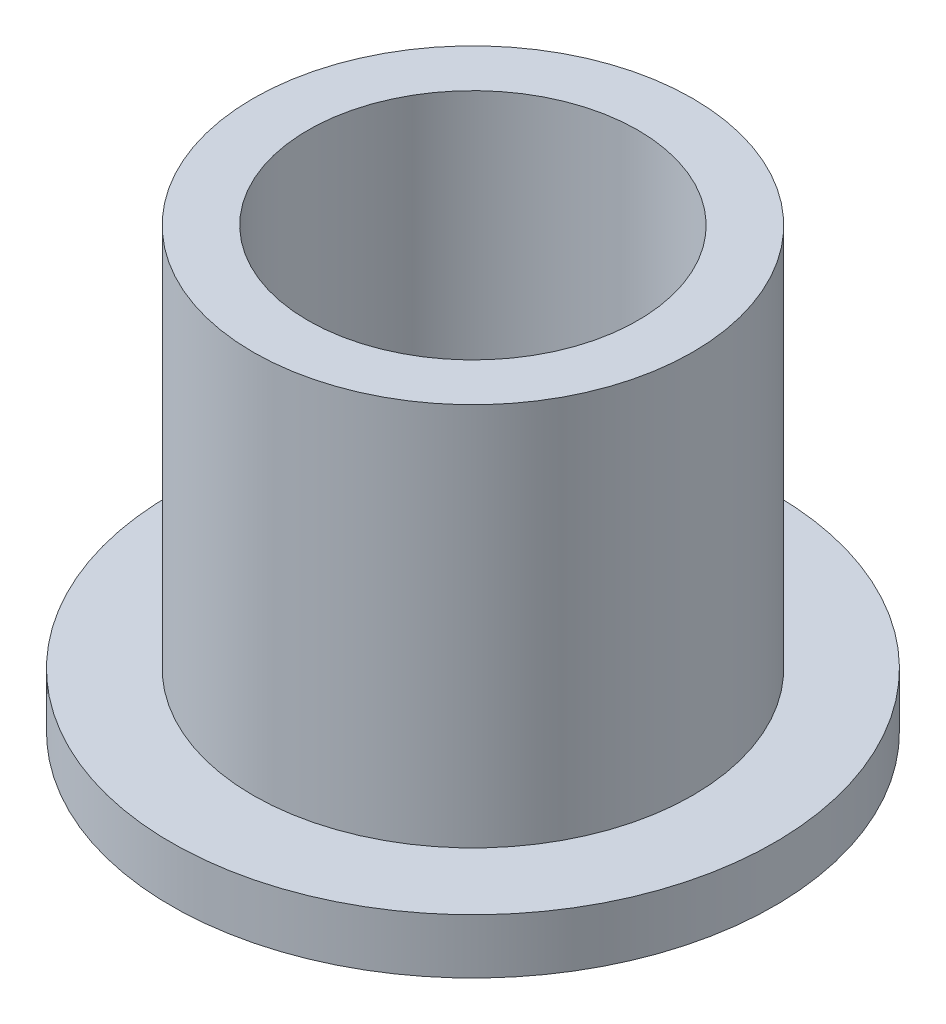
ISO-10303-21;
HEADER;
FILE_DESCRIPTION(('STEP AP214'),'2;1');
FILE_NAME('part.step','',(''),(''),'','','');
FILE_SCHEMA(('AUTOMOTIVE_DESIGN { 1 0 10303 214 1 1 1 1 }'));
ENDSEC;
DATA;
#1=APPLICATION_CONTEXT('core data for automotive mechanical design processes');
#2=APPLICATION_PROTOCOL_DEFINITION('international standard','automotive_design',2000,#1);
#3=PRODUCT_CONTEXT('',#1,'mechanical');
#4=PRODUCT('Part','Part','',(#3));
#5=PRODUCT_RELATED_PRODUCT_CATEGORY('part','',(#4));
#6=PRODUCT_DEFINITION_FORMATION('','',#4);
#7=PRODUCT_DEFINITION_CONTEXT('part definition',#1,'design');
#8=PRODUCT_DEFINITION('design','',#6,#7);
#9=PRODUCT_DEFINITION_SHAPE('','',#8);
#10=(LENGTH_UNIT() NAMED_UNIT(*) SI_UNIT(.MILLI.,.METRE.));
#11=(NAMED_UNIT(*) PLANE_ANGLE_UNIT() SI_UNIT($,.RADIAN.));
#12=(NAMED_UNIT(*) SI_UNIT($,.STERADIAN.) SOLID_ANGLE_UNIT());
#13=UNCERTAINTY_MEASURE_WITH_UNIT(LENGTH_MEASURE(1.E-05),#10,'distance_accuracy_value','');
#14=(GEOMETRIC_REPRESENTATION_CONTEXT(3) GLOBAL_UNCERTAINTY_ASSIGNED_CONTEXT((#13)) GLOBAL_UNIT_ASSIGNED_CONTEXT((#10,
#11,#12)) REPRESENTATION_CONTEXT('',''));
#15=CARTESIAN_POINT('',(0.,0.,0.));
#16=DIRECTION('',(0.,0.,1.));
#17=DIRECTION('',(1.,0.,0.));
#18=AXIS2_PLACEMENT_3D('',#15,#16,#17);
#19=CARTESIAN_POINT('',(0.,0.,0.));
#20=DIRECTION('',(0.,1.,0.));
#21=DIRECTION('',(0.,0.,1.));
#22=AXIS2_PLACEMENT_3D('',#19,#20,#21);
#23=PLANE('',#22);
#24=CARTESIAN_POINT('',(0.,0.,0.));
#25=DIRECTION('',(0.,-1.,0.));
#26=DIRECTION('',(0.,0.,-1.));
#27=AXIS2_PLACEMENT_3D('',#24,#25,#26);
#28=CIRCLE('',#27,4.7752);
#29=CARTESIAN_POINT('',(0.,0.,-4.7752));
#30=VERTEX_POINT('',#29);
#31=EDGE_CURVE('E17',#30,#30,#28,.F.);
#32=ORIENTED_EDGE('',*,*,#31,.T.);
#33=EDGE_LOOP('',(#32));
#34=FACE_BOUND('',#33,.T.);
#35=CARTESIAN_POINT('',(0.,0.,0.));
#36=DIRECTION('',(0.,-1.,0.));
#37=DIRECTION('',(0.,0.,-1.));
#38=AXIS2_PLACEMENT_3D('',#35,#36,#37);
#39=CIRCLE('',#38,8.73125);
#40=CARTESIAN_POINT('',(0.,0.,-8.73125));
#41=VERTEX_POINT('',#40);
#42=EDGE_CURVE('E33',#41,#41,#39,.F.);
#43=ORIENTED_EDGE('',*,*,#42,.F.);
#44=EDGE_LOOP('',(#43));
#45=FACE_BOUND('',#44,.T.);
#46=ADVANCED_FACE('F14',(#34,#45),#23,.F.);
#47=CARTESIAN_POINT('',(0.,12.7,0.));
#48=DIRECTION('',(0.,-1.,0.));
#49=DIRECTION('',(0.,0.,-1.));
#50=AXIS2_PLACEMENT_3D('',#47,#48,#49);
#51=CYLINDRICAL_SURFACE('',#50,4.7752);
#52=ORIENTED_EDGE('',*,*,#31,.F.);
#53=EDGE_LOOP('',(#52));
#54=FACE_BOUND('',#53,.T.);
#55=CARTESIAN_POINT('',(0.,12.7,0.));
#56=DIRECTION('',(0.,-1.,0.));
#57=DIRECTION('',(0.,0.,-1.));
#58=AXIS2_PLACEMENT_3D('',#55,#56,#57);
#59=CIRCLE('',#58,4.7752);
#60=CARTESIAN_POINT('',(0.,12.7,-4.7752));
#61=VERTEX_POINT('',#60);
#62=EDGE_CURVE('E31',#61,#61,#59,.T.);
#63=ORIENTED_EDGE('',*,*,#62,.F.);
#64=EDGE_LOOP('',(#63));
#65=FACE_BOUND('',#64,.T.);
#66=ADVANCED_FACE('F42',(#54,#65),#51,.F.);
#67=CARTESIAN_POINT('',(0.,1.5875,0.));
#68=DIRECTION('',(0.,-1.,0.));
#69=DIRECTION('',(0.,0.,-1.));
#70=AXIS2_PLACEMENT_3D('',#67,#68,#69);
#71=CYLINDRICAL_SURFACE('',#70,8.73125);
#72=ORIENTED_EDGE('',*,*,#42,.T.);
#73=EDGE_LOOP('',(#72));
#74=FACE_BOUND('',#73,.T.);
#75=CARTESIAN_POINT('',(0.,1.5875,0.));
#76=DIRECTION('',(0.,-1.,0.));
#77=DIRECTION('',(0.,0.,-1.));
#78=AXIS2_PLACEMENT_3D('',#75,#76,#77);
#79=CIRCLE('',#78,8.73125);
#80=CARTESIAN_POINT('',(0.,1.5875,-8.73125));
#81=VERTEX_POINT('',#80);
#82=EDGE_CURVE('E26',#81,#81,#79,.F.);
#83=ORIENTED_EDGE('',*,*,#82,.F.);
#84=EDGE_LOOP('',(#83));
#85=FACE_BOUND('',#84,.T.);
#86=ADVANCED_FACE('F45',(#74,#85),#71,.T.);
#87=CARTESIAN_POINT('',(0.,12.7,0.));
#88=DIRECTION('',(0.,1.,0.));
#89=DIRECTION('',(0.,0.,1.));
#90=AXIS2_PLACEMENT_3D('',#87,#88,#89);
#91=PLANE('',#90);
#92=ORIENTED_EDGE('',*,*,#62,.T.);
#93=EDGE_LOOP('',(#92));
#94=FACE_BOUND('',#93,.T.);
#95=CARTESIAN_POINT('',(0.,12.7,0.));
#96=DIRECTION('',(0.,-1.,0.));
#97=DIRECTION('',(0.,0.,-1.));
#98=AXIS2_PLACEMENT_3D('',#95,#96,#97);
#99=CIRCLE('',#98,6.3627);
#100=CARTESIAN_POINT('',(0.,12.7,-6.3627));
#101=VERTEX_POINT('',#100);
#102=EDGE_CURVE('E21',#101,#101,#99,.T.);
#103=ORIENTED_EDGE('',*,*,#102,.F.);
#104=EDGE_LOOP('',(#103));
#105=FACE_BOUND('',#104,.T.);
#106=ADVANCED_FACE('F48',(#94,#105),#91,.T.);
#107=CARTESIAN_POINT('',(0.,1.5875,0.));
#108=DIRECTION('',(0.,1.,0.));
#109=DIRECTION('',(0.,0.,1.));
#110=AXIS2_PLACEMENT_3D('',#107,#108,#109);
#111=PLANE('',#110);
#112=CARTESIAN_POINT('',(0.,1.5875,0.));
#113=DIRECTION('',(0.,-1.,0.));
#114=DIRECTION('',(0.,0.,-1.));
#115=AXIS2_PLACEMENT_3D('',#112,#113,#114);
#116=CIRCLE('',#115,6.3627);
#117=CARTESIAN_POINT('',(0.,1.5875,-6.3627));
#118=VERTEX_POINT('',#117);
#119=EDGE_CURVE('E10',#118,#118,#116,.F.);
#120=ORIENTED_EDGE('',*,*,#119,.F.);
#121=EDGE_LOOP('',(#120));
#122=FACE_BOUND('',#121,.T.);
#123=ORIENTED_EDGE('',*,*,#82,.T.);
#124=EDGE_LOOP('',(#123));
#125=FACE_BOUND('',#124,.T.);
#126=ADVANCED_FACE('F51',(#122,#125),#111,.T.);
#127=CARTESIAN_POINT('',(0.,12.7,0.));
#128=DIRECTION('',(0.,-1.,0.));
#129=DIRECTION('',(0.,0.,-1.));
#130=AXIS2_PLACEMENT_3D('',#127,#128,#129);
#131=CYLINDRICAL_SURFACE('',#130,6.3627);
#132=ORIENTED_EDGE('',*,*,#119,.T.);
#133=EDGE_LOOP('',(#132));
#134=FACE_BOUND('',#133,.T.);
#135=ORIENTED_EDGE('',*,*,#102,.T.);
#136=EDGE_LOOP('',(#135));
#137=FACE_BOUND('',#136,.T.);
#138=ADVANCED_FACE('F55',(#134,#137),#131,.T.);
#139=CLOSED_SHELL('',(#46,#66,#86,#106,#126,#138));
#140=MANIFOLD_SOLID_BREP('B1',#139);
#141=ADVANCED_BREP_SHAPE_REPRESENTATION('',(#18,#140),#14);
#142=SHAPE_DEFINITION_REPRESENTATION(#9,#141);
ENDSEC;
END-ISO-10303-21;
